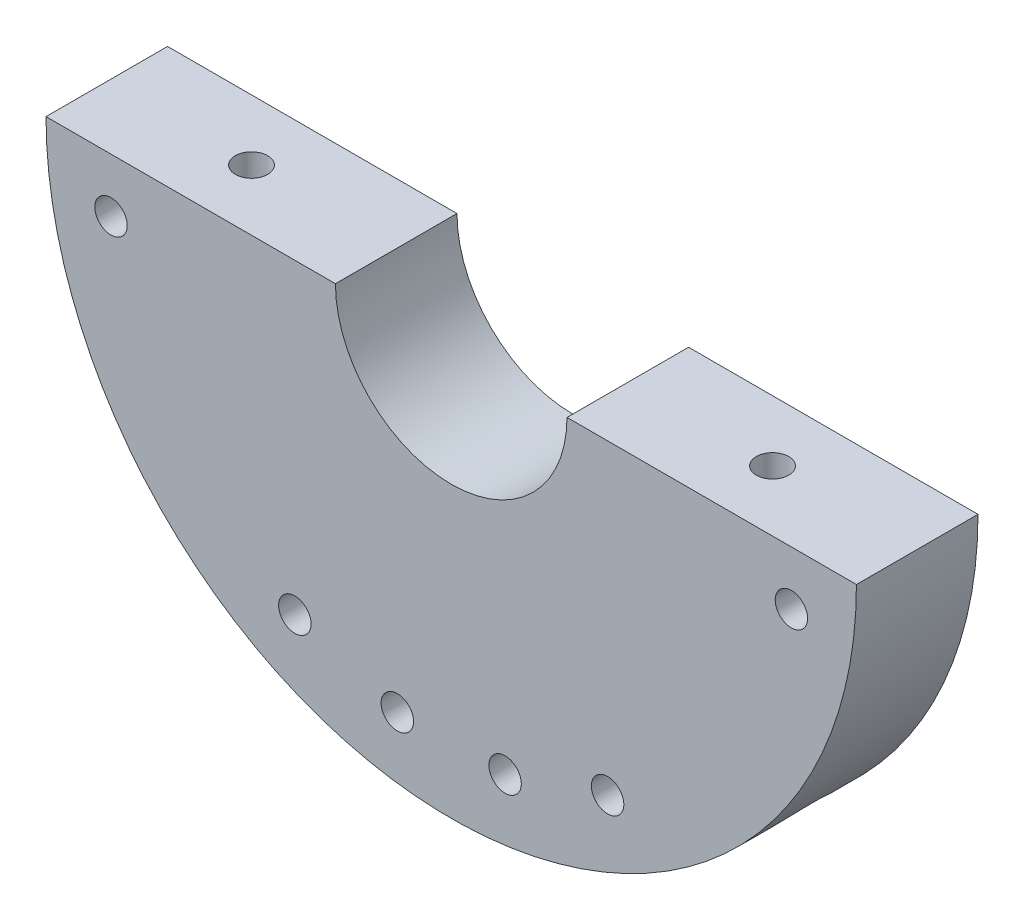
ISO-10303-21;
HEADER;
FILE_DESCRIPTION(('STEP AP214'),'2;1');
FILE_NAME('part.step','',(''),(''),'','','');
FILE_SCHEMA(('AUTOMOTIVE_DESIGN { 1 0 10303 214 1 1 1 1 }'));
ENDSEC;
DATA;
#1=APPLICATION_CONTEXT('core data for automotive mechanical design processes');
#2=APPLICATION_PROTOCOL_DEFINITION('international standard','automotive_design',2000,#1);
#3=PRODUCT_CONTEXT('',#1,'mechanical');
#4=PRODUCT('Part','Part','',(#3));
#5=PRODUCT_RELATED_PRODUCT_CATEGORY('part','',(#4));
#6=PRODUCT_DEFINITION_FORMATION('','',#4);
#7=PRODUCT_DEFINITION_CONTEXT('part definition',#1,'design');
#8=PRODUCT_DEFINITION('design','',#6,#7);
#9=PRODUCT_DEFINITION_SHAPE('','',#8);
#10=(LENGTH_UNIT() NAMED_UNIT(*) SI_UNIT(.MILLI.,.METRE.));
#11=(NAMED_UNIT(*) PLANE_ANGLE_UNIT() SI_UNIT($,.RADIAN.));
#12=(NAMED_UNIT(*) SI_UNIT($,.STERADIAN.) SOLID_ANGLE_UNIT());
#13=UNCERTAINTY_MEASURE_WITH_UNIT(LENGTH_MEASURE(1.E-05),#10,'distance_accuracy_value','');
#14=(GEOMETRIC_REPRESENTATION_CONTEXT(3) GLOBAL_UNCERTAINTY_ASSIGNED_CONTEXT((#13)) GLOBAL_UNIT_ASSIGNED_CONTEXT((#10,
#11,#12)) REPRESENTATION_CONTEXT('',''));
#15=CARTESIAN_POINT('',(0.,0.,0.));
#16=DIRECTION('',(0.,0.,1.));
#17=DIRECTION('',(1.,0.,0.));
#18=AXIS2_PLACEMENT_3D('',#15,#16,#17);
#19=CARTESIAN_POINT('',(0.,0.,30.));
#20=DIRECTION('',(0.,0.,-1.));
#21=DIRECTION('',(-1.,0.,0.));
#22=AXIS2_PLACEMENT_3D('',#19,#20,#21);
#23=CYLINDRICAL_SURFACE('',#22,28.575);
#24=CARTESIAN_POINT('',(0.,0.,0.));
#25=DIRECTION('',(0.,0.,-1.));
#26=DIRECTION('',(1.,0.,0.));
#27=AXIS2_PLACEMENT_3D('',#24,#25,#26);
#28=CIRCLE('',#27,28.575);
#29=CARTESIAN_POINT('',(28.575,0.,0.));
#30=VERTEX_POINT('',#29);
#31=CARTESIAN_POINT('',(-28.575,0.,0.));
#32=VERTEX_POINT('',#31);
#33=EDGE_CURVE('E102',#30,#32,#28,.T.);
#34=ORIENTED_EDGE('',*,*,#33,.T.);
#35=DIRECTION('',(0.,0.,-1.));
#36=VECTOR('',#35,1.);
#37=CARTESIAN_POINT('',(-28.575,0.,30.));
#38=LINE('',#37,#36);
#39=CARTESIAN_POINT('',(-28.575,0.,30.));
#40=VERTEX_POINT('',#39);
#41=EDGE_CURVE('E11',#40,#32,#38,.T.);
#42=ORIENTED_EDGE('',*,*,#41,.F.);
#43=CARTESIAN_POINT('',(0.,0.,30.));
#44=DIRECTION('',(0.,0.,-1.));
#45=DIRECTION('',(1.,0.,0.));
#46=AXIS2_PLACEMENT_3D('',#43,#44,#45);
#47=CIRCLE('',#46,28.575);
#48=CARTESIAN_POINT('',(28.575,0.,30.));
#49=VERTEX_POINT('',#48);
#50=EDGE_CURVE('E89',#49,#40,#47,.T.);
#51=ORIENTED_EDGE('',*,*,#50,.F.);
#52=DIRECTION('',(0.,0.,-1.));
#53=VECTOR('',#52,1.);
#54=CARTESIAN_POINT('',(28.575,0.,30.));
#55=LINE('',#54,#53);
#56=EDGE_CURVE('E98',#49,#30,#55,.T.);
#57=ORIENTED_EDGE('',*,*,#56,.T.);
#58=EDGE_LOOP('',(#34,#42,#51,#57));
#59=FACE_BOUND('',#58,.T.);
#60=ADVANCED_FACE('F32',(#59),#23,.F.);
#61=CARTESIAN_POINT('',(-100.,0.,30.));
#62=DIRECTION('',(0.,-1.,0.));
#63=DIRECTION('',(0.,0.,-1.));
#64=AXIS2_PLACEMENT_3D('',#61,#62,#63);
#65=PLANE('',#64);
#66=CARTESIAN_POINT('',(-64.2875,0.,15.));
#67=DIRECTION('',(0.,1.,0.));
#68=DIRECTION('',(0.,0.,1.));
#69=AXIS2_PLACEMENT_3D('',#66,#67,#68);
#70=CIRCLE('',#69,4.00000000000001);
#71=CARTESIAN_POINT('',(-64.2875,0.,19.));
#72=VERTEX_POINT('',#71);
#73=EDGE_CURVE('E105',#72,#72,#70,.T.);
#74=ORIENTED_EDGE('',*,*,#73,.F.);
#75=EDGE_LOOP('',(#74));
#76=FACE_BOUND('',#75,.T.);
#77=DIRECTION('',(-1.,0.,0.));
#78=VECTOR('',#77,1.);
#79=CARTESIAN_POINT('',(-100.,0.,0.));
#80=LINE('',#79,#78);
#81=CARTESIAN_POINT('',(-100.,0.,0.));
#82=VERTEX_POINT('',#81);
#83=EDGE_CURVE('E93',#32,#82,#80,.T.);
#84=ORIENTED_EDGE('',*,*,#83,.T.);
#85=DIRECTION('',(0.,0.,-1.));
#86=VECTOR('',#85,1.);
#87=CARTESIAN_POINT('',(-100.,0.,30.));
#88=LINE('',#87,#86);
#89=CARTESIAN_POINT('',(-100.,0.,30.));
#90=VERTEX_POINT('',#89);
#91=EDGE_CURVE('E45',#90,#82,#88,.T.);
#92=ORIENTED_EDGE('',*,*,#91,.F.);
#93=DIRECTION('',(-1.,0.,0.));
#94=VECTOR('',#93,1.);
#95=CARTESIAN_POINT('',(-100.,0.,30.));
#96=LINE('',#95,#94);
#97=EDGE_CURVE('E84',#40,#90,#96,.T.);
#98=ORIENTED_EDGE('',*,*,#97,.F.);
#99=ORIENTED_EDGE('',*,*,#41,.T.);
#100=EDGE_LOOP('',(#84,#92,#98,#99));
#101=FACE_BOUND('',#100,.T.);
#102=ADVANCED_FACE('F92',(#76,#101),#65,.F.);
#103=CARTESIAN_POINT('',(0.,0.,30.));
#104=DIRECTION('',(0.,0.,-1.));
#105=DIRECTION('',(-1.,0.,0.));
#106=AXIS2_PLACEMENT_3D('',#103,#104,#105);
#107=CYLINDRICAL_SURFACE('',#106,100.);
#108=CARTESIAN_POINT('',(-64.2875,-76.5971105443933,25.));
#109=CARTESIAN_POINT('',(-63.9629517728713,-76.8695019134588,24.9999998950727));
#110=CARTESIAN_POINT('',(-63.6366605399097,-77.1398338687823,24.9842079024863));
#111=CARTESIAN_POINT('',(-62.9824691419189,-77.6748811896209,24.9199266253946));
#112=CARTESIAN_POINT('',(-62.6545684866213,-77.9395946935992,24.8714266731006));
#113=CARTESIAN_POINT('',(-61.9993507515758,-78.4618132880969,24.7404351897563));
#114=CARTESIAN_POINT('',(-61.6720343056246,-78.7193127411085,24.6579178254226));
#115=CARTESIAN_POINT('',(-61.0210649378347,-79.2249919935222,24.4576058012039));
#116=CARTESIAN_POINT('',(-60.6974109623269,-79.4731745235494,24.3398215696995));
#117=CARTESIAN_POINT('',(-60.1200607640356,-79.9104655120402,24.0945332296665));
#118=CARTESIAN_POINT('',(-59.865130516254,-80.1015886110365,23.9735023051019));
#119=CARTESIAN_POINT('',(-59.3617301504954,-80.4753577280151,23.7073430088573));
#120=CARTESIAN_POINT('',(-59.113258875236,-80.6580052692694,23.5622189889461));
#121=CARTESIAN_POINT('',(-58.6252886222249,-81.0133726344612,23.2476381579096));
#122=CARTESIAN_POINT('',(-58.385779437742,-81.1861038795959,23.0782101597295));
#123=CARTESIAN_POINT('',(-57.9179724809073,-81.5204949099328,22.7147145389277));
#124=CARTESIAN_POINT('',(-57.6896729882618,-81.6821563954661,22.5206507135329));
#125=CARTESIAN_POINT('',(-57.2832743065724,-81.9675405816638,22.1417706970943));
#126=CARTESIAN_POINT('',(-57.103068567596,-82.093145772091,21.9606263784874));
#127=CARTESIAN_POINT('',(-56.754253877509,-82.3346807222192,21.5815288192315));
#128=CARTESIAN_POINT('',(-56.5856427000848,-82.4506123402951,21.3835788219052));
#129=CARTESIAN_POINT('',(-56.261848193746,-82.6718991443045,20.9713982044766));
#130=CARTESIAN_POINT('',(-56.1066655144979,-82.7772538185682,20.7571667976255));
#131=CARTESIAN_POINT('',(-55.8116539480961,-82.9764483080265,20.3132890861533));
#132=CARTESIAN_POINT('',(-55.6718253107279,-83.0702879358928,20.0836425308504));
#133=CARTESIAN_POINT('',(-55.4085556693316,-83.2461242509405,19.6085351698538));
#134=CARTESIAN_POINT('',(-55.2852319780441,-83.328036489372,19.3629778550541));
#135=CARTESIAN_POINT('',(-55.0579770496234,-83.4783669293242,18.8590533988895));
#136=CARTESIAN_POINT('',(-54.9540462178584,-83.5467848487754,18.6006859898987));
#137=CARTESIAN_POINT('',(-54.7673523681255,-83.6692870232798,18.0732718872626));
#138=CARTESIAN_POINT('',(-54.6845780925871,-83.7233789018894,17.8042309614953));
#139=CARTESIAN_POINT('',(-54.5416007240802,-83.8165920337851,17.2576974085827));
#140=CARTESIAN_POINT('',(-54.481394480968,-83.8557153764598,16.980205966848));
#141=CARTESIAN_POINT('',(-54.3904912986089,-83.9147007889124,16.4532263704925));
#142=CARTESIAN_POINT('',(-54.3571128725552,-83.9363156468991,16.2043926124368));
#143=CARTESIAN_POINT('',(-54.3091609902186,-83.9673499616295,15.7041732355423));
#144=CARTESIAN_POINT('',(-54.294585848622,-83.9767705113333,15.4527878474384));
#145=CARTESIAN_POINT('',(-54.2844617952553,-83.9833152612984,14.9495669406198));
#146=CARTESIAN_POINT('',(-54.288906099931,-83.9804438456627,14.6977316144103));
#147=CARTESIAN_POINT('',(-54.3167378718886,-83.9624455467664,14.1955526045503));
#148=CARTESIAN_POINT('',(-54.3401249873757,-83.9473188911031,13.9452088932854));
#149=CARTESIAN_POINT('',(-54.4035653107796,-83.9062179423422,13.46261621164));
#150=CARTESIAN_POINT('',(-54.4425591920584,-83.8809328149326,13.2301679442657));
#151=CARTESIAN_POINT('',(-54.536501861728,-83.8198848689336,12.7699349549747));
#152=CARTESIAN_POINT('',(-54.5914497924094,-83.7841226136065,12.5421499830581));
#153=CARTESIAN_POINT('',(-54.7166076930153,-83.7024397412082,12.0926914783492));
#154=CARTESIAN_POINT('',(-54.7868173992966,-83.6565192996167,11.8710178400597));
#155=CARTESIAN_POINT('',(-54.9416555557975,-83.5549104022568,11.4350731117044));
#156=CARTESIAN_POINT('',(-55.0262845399231,-83.4992215847902,11.2208022960981));
#157=CARTESIAN_POINT('',(-55.2120609187414,-83.3765022443579,10.7937635210634));
#158=CARTESIAN_POINT('',(-55.3136667901778,-83.3091542114949,10.5812864968271));
#159=CARTESIAN_POINT('',(-55.5300946393286,-83.1650496525276,10.1665149127583));
#160=CARTESIAN_POINT('',(-55.644916785231,-83.08829300669,9.96422048255483));
#161=CARTESIAN_POINT('',(-55.8865752091646,-82.9259422073476,9.57065482292584));
#162=CARTESIAN_POINT('',(-56.0134121179811,-82.8403475898205,9.37938417310721));
#163=CARTESIAN_POINT('',(-56.2779108505139,-82.6608874085786,9.00847294326511));
#164=CARTESIAN_POINT('',(-56.4155767052257,-82.5670187633353,8.82883673988206));
#165=CARTESIAN_POINT('',(-56.7159303221589,-82.3610336073531,8.46293314334318));
#166=CARTESIAN_POINT('',(-56.8797131334051,-82.2480418955664,8.27805557388535));
#167=CARTESIAN_POINT('',(-57.2174635048655,-82.0134395395503,7.92366080987084));
#168=CARTESIAN_POINT('',(-57.3914348479137,-81.8918256904888,7.75414938079013));
#169=CARTESIAN_POINT('',(-57.9263294591353,-81.5152123100459,7.26908966043244));
#170=CARTESIAN_POINT('',(-58.3003553743622,-81.248357663653,6.97686958944483));
#171=CARTESIAN_POINT('',(-59.1357420851636,-80.6428688156005,6.41196230962961));
#172=CARTESIAN_POINT('',(-59.6013094812153,-80.2996655201661,6.15052024197426));
#173=CARTESIAN_POINT('',(-60.5505101465405,-79.5863571337917,5.70974347246658));
#174=CARTESIAN_POINT('',(-61.0341539771382,-79.2162361926539,5.53045760858505));
#175=CARTESIAN_POINT('',(-61.8128265356257,-78.6086018811884,5.30627439739788));
#176=CARTESIAN_POINT('',(-62.1058441613575,-78.3773259461806,5.23631078309917));
#177=CARTESIAN_POINT('',(-62.6924209543452,-77.9089275253372,5.12351931882922));
#178=CARTESIAN_POINT('',(-62.9859800544241,-77.6718057248329,5.08068830357667));
#179=CARTESIAN_POINT('',(-63.5721532596953,-77.1927767084335,5.02126533797157));
#180=CARTESIAN_POINT('',(-63.8647665310273,-76.9508661657963,5.00469232661182));
#181=CARTESIAN_POINT('',(-64.4474035049074,-76.4635628188044,4.99703473770572));
#182=CARTESIAN_POINT('',(-64.7374271072784,-76.2181698806815,5.00595114192732));
#183=CARTESIAN_POINT('',(-65.367612821924,-75.6787807296257,5.05258673327036));
#184=CARTESIAN_POINT('',(-65.7069865607622,-75.3842934632284,5.09539002052659));
#185=CARTESIAN_POINT('',(-66.3783746784963,-74.7937919764094,5.21508576028551));
#186=CARTESIAN_POINT('',(-66.7103878630813,-74.4977775176555,5.29198370303256));
#187=CARTESIAN_POINT('',(-67.3654273715905,-73.905981765029,5.47936497113526));
#188=CARTESIAN_POINT('',(-67.6884477120844,-73.610200747891,5.58987010052805));
#189=CARTESIAN_POINT('',(-68.3234464719175,-73.0211896175313,5.84423092048077));
#190=CARTESIAN_POINT('',(-68.6354264841038,-72.7279591409716,5.9880817772767));
#191=CARTESIAN_POINT('',(-69.2135094285256,-72.1777789099009,6.29200012201713));
#192=CARTESIAN_POINT('',(-69.4809326010403,-71.9203254753562,6.44864814463729));
#193=CARTESIAN_POINT('',(-70.0039825872914,-71.4113124658167,6.78908021379796));
#194=CARTESIAN_POINT('',(-70.2596084549844,-71.159753364291,6.97286643164531));
#195=CARTESIAN_POINT('',(-70.7568610481115,-70.6653337291707,7.36795617206928));
#196=CARTESIAN_POINT('',(-70.9985056592362,-70.4224622409021,7.57922336205108));
#197=CARTESIAN_POINT('',(-71.4658338879364,-69.9481613151105,8.03028509039801));
#198=CARTESIAN_POINT('',(-71.6915239819197,-69.7167272464164,8.27006794615709));
#199=CARTESIAN_POINT('',(-72.0559046435133,-69.3396867299787,8.69887319146313));
#200=CARTESIAN_POINT('',(-72.1996042847782,-69.1900104502962,8.8800896250563));
#201=CARTESIAN_POINT('',(-72.4770314872022,-68.8993485231884,9.25663403711663));
#202=CARTESIAN_POINT('',(-72.6107596283696,-68.7583623703707,9.45196119350769));
#203=CARTESIAN_POINT('',(-72.8667355858708,-68.4870324022109,9.85665650007738));
#204=CARTESIAN_POINT('',(-72.9889956436174,-68.3566772588446,10.0660092599076));
#205=CARTESIAN_POINT('',(-73.22057102674,-68.1085659867326,10.4988405888884));
#206=CARTESIAN_POINT('',(-73.3298909505476,-67.9908053838098,10.7223140964993));
#207=CARTESIAN_POINT('',(-73.5118689850752,-67.793945481516,11.1334605131034));
#208=CARTESIAN_POINT('',(-73.5873576260511,-67.7119756868083,11.3185095532096));
#209=CARTESIAN_POINT('',(-73.728250188026,-67.5585373394029,11.6965338408945));
#210=CARTESIAN_POINT('',(-73.7936597524541,-67.4870629112517,11.8895045757753));
#211=CARTESIAN_POINT('',(-73.9134230112139,-67.3558742469153,12.2826820148191));
#212=CARTESIAN_POINT('',(-73.9677807313025,-67.2961557287625,12.4828860527624));
#213=CARTESIAN_POINT('',(-74.0645028724382,-67.1896911513701,12.8895752101037));
#214=CARTESIAN_POINT('',(-74.1068672291002,-67.1429451617722,13.0960603632146));
#215=CARTESIAN_POINT('',(-74.1790303579318,-67.063211840055,13.5156481608527));
#216=CARTESIAN_POINT('',(-74.2087239920269,-67.0303396524493,13.7287910017204));
#217=CARTESIAN_POINT('',(-74.2543578504359,-66.9797843302381,14.15834349671));
#218=CARTESIAN_POINT('',(-74.2702981379848,-66.9621011257969,14.3747531358071));
#219=CARTESIAN_POINT('',(-74.2880294333794,-66.9424294517646,14.8087793613365));
#220=CARTESIAN_POINT('',(-74.2898261485454,-66.9404346514713,15.0263954254649));
#221=CARTESIAN_POINT('',(-74.2792379369151,-66.9521835050522,15.4608430663889));
#222=CARTESIAN_POINT('',(-74.2668541349862,-66.9659259105749,15.6776747040405));
#223=CARTESIAN_POINT('',(-74.2305957080315,-67.0061137422655,16.0820669688064));
#224=CARTESIAN_POINT('',(-74.2083189559577,-67.0307919443402,16.2699522002876));
#225=CARTESIAN_POINT('',(-74.1534945846355,-67.0914369476683,16.6424368384239));
#226=CARTESIAN_POINT('',(-74.1209432156959,-67.1274078701409,16.8270350194561));
#227=CARTESIAN_POINT('',(-74.0461141754355,-67.2099402653216,17.1918313858531));
#228=CARTESIAN_POINT('',(-74.0038361025777,-67.2565021752454,17.3720293892304));
#229=CARTESIAN_POINT('',(-73.9101861440726,-67.3594033590699,17.7272076665236));
#230=CARTESIAN_POINT('',(-73.8588123405502,-67.4157446949568,17.9021868309143));
#231=CARTESIAN_POINT('',(-73.728566688712,-67.5582022189692,18.3053313384371));
#232=CARTESIAN_POINT('',(-73.6463079861344,-67.6479016499215,18.5311456649943));
#233=CARTESIAN_POINT('',(-73.4682532482857,-67.841233976529,18.9711652631048));
#234=CARTESIAN_POINT('',(-73.3724532909374,-67.9448709086061,19.1853671462832));
#235=CARTESIAN_POINT('',(-73.1687252493826,-68.1642139919544,19.6019207641407));
#236=CARTESIAN_POINT('',(-73.0607788745197,-68.2799383256957,19.8042539101129));
#237=CARTESIAN_POINT('',(-72.8342831386866,-68.5214903224244,20.1965186530575));
#238=CARTESIAN_POINT('',(-72.7157332797904,-68.6473184598453,20.3864496669161));
#239=CARTESIAN_POINT('',(-72.4193719912496,-68.9601174031217,20.8283141887979));
#240=CARTESIAN_POINT('',(-72.2369836916278,-69.1512354069067,21.0742579545904));
#241=CARTESIAN_POINT('',(-71.8564683529036,-69.5465550511894,21.5423044211171));
#242=CARTESIAN_POINT('',(-71.6583352281862,-69.750761744709,21.7643978245674));
#243=CARTESIAN_POINT('',(-71.2482278831173,-70.1696235461056,22.185738339949));
#244=CARTESIAN_POINT('',(-71.0362297963331,-70.3842964993492,22.3849443389662));
#245=CARTESIAN_POINT('',(-70.6005289743909,-70.8213286185023,22.7606972062608));
#246=CARTESIAN_POINT('',(-70.3768265517705,-71.0436875791207,22.9372446791482));
#247=CARTESIAN_POINT('',(-69.8477798638598,-71.5644106601263,23.3198902226587));
#248=CARTESIAN_POINT('',(-69.538723124665,-71.8648607392302,23.5180449396095));
#249=CARTESIAN_POINT('',(-68.9055782172428,-72.4721595503726,23.8772673899845));
#250=CARTESIAN_POINT('',(-68.5814843556527,-72.7790106813757,24.0383209361865));
#251=CARTESIAN_POINT('',(-67.9211761232697,-73.3956235159915,24.3233837705609));
#252=CARTESIAN_POINT('',(-67.5849826563888,-73.7053795749972,24.4474538061984));
#253=CARTESIAN_POINT('',(-66.9022085677099,-74.3256826947805,24.6587230738265));
#254=CARTESIAN_POINT('',(-66.5556328816891,-74.636229317429,24.7459395374562));
#255=CARTESIAN_POINT('',(-65.8910220460529,-75.2233249805003,24.8757757297461));
#256=CARTESIAN_POINT('',(-65.5738287296471,-75.5000075663545,24.9221269590012));
#257=CARTESIAN_POINT('',(-64.9341706316662,-76.0508489231398,24.9842417081516));
#258=CARTESIAN_POINT('',(-64.611704976275,-76.3250072636985,25.0000001048163));
#259=CARTESIAN_POINT('',(-64.2875,-76.5971105443933,25.));
#260=B_SPLINE_CURVE_WITH_KNOTS('',3,(#108,#109,#110,#111,#112,#113,#114,#115,#116,#117,#118,
#119,#120,#121,#122,#123,#124,#125,#126,#127,#128,#129,#130,#131,#132,#133,#134,#135,#136,#137,
#138,#139,#140,#141,#142,#143,#144,#145,#146,#147,#148,#149,#150,#151,#152,#153,#154,#155,#156,
#157,#158,#159,#160,#161,#162,#163,#164,#165,#166,#167,#168,#169,#170,#171,#172,#173,#174,#175,
#176,#177,#178,#179,#180,#181,#182,#183,#184,#185,#186,#187,#188,#189,#190,#191,#192,#193,#194,
#195,#196,#197,#198,#199,#200,#201,#202,#203,#204,#205,#206,#207,#208,#209,#210,#211,#212,#213,
#214,#215,#216,#217,#218,#219,#220,#221,#222,#223,#224,#225,#226,#227,#228,#229,#230,#231,#232,
#233,#234,#235,#236,#237,#238,#239,#240,#241,#242,#243,#244,#245,#246,#247,#248,#249,#250,#251,
#252,#253,#254,#255,#256,#257,#258,#259),.UNSPECIFIED.,.T.,.F.,(4,2,2,2,2,2,2,2,2,2,2,2,2,2,2,2,
2,2,2,2,2,2,2,2,2,2,2,2,2,2,2,2,2,2,2,2,2,2,2,2,2,2,2,2,2,2,2,2,2,2,2,2,2,2,2,2,2,2,2,2,2,2,2,2,
2,2,2,2,2,2,2,2,2,2,2,4),(0.,1.27081836579593,2.54205141298656,3.81425163537231,
5.08607604019589,6.10763940847684,7.12901845920287,8.14919649733743,9.16921748149424,
10.0225384732423,10.875695155573,11.7288930903111,12.5821049031458,13.4410910795334,
14.3000952092593,15.1586413000316,16.0170675065637,16.7720633475169,17.526991514477,
18.2816504480822,19.0362953669174,19.7466254362272,20.4569173243884,21.1671969434205,
21.8775028678666,22.6116095979196,23.3457256711219,24.0798803074403,24.8143095325681,
25.6283012902504,26.4425972096248,28.0705711334956,29.9680933503157,31.866742095563,
33.0052222180455,34.1435695012888,35.2827374620142,36.4219493003122,37.7746311674901,
39.1275309354702,40.4813103318395,41.8348936082554,43.0425707903207,44.2503446501484,
45.4565376405969,46.6622381563336,47.4881063620477,48.3139264922758,49.1388548369402,
49.9634891477206,50.6109511379816,51.2580492766754,51.9049112787235,52.5517767533222,
53.2039100148531,53.8560402779929,54.5079073751422,55.1597227666156,55.7314928004039,
56.303471741713,56.8754742996539,57.4475976108233,58.2160255435877,58.984676500963,
59.7545008237781,60.5243613155679,61.6055731741608,62.6872049894998,63.7707503403156,
64.8542667722735,66.2755350803036,67.697345972341,69.116808426757,70.535606446171,
71.8048682219256,73.0743425363527),.UNSPECIFIED.);
#261=CARTESIAN_POINT('',(-64.2875,-76.5971105443933,25.));
#262=VERTEX_POINT('',#261);
#263=EDGE_CURVE('E35',#262,#262,#260,.T.);
#264=ORIENTED_EDGE('',*,*,#263,.T.);
#265=EDGE_LOOP('',(#264));
#266=FACE_BOUND('',#265,.T.);
#267=CARTESIAN_POINT('',(64.2875,-76.5971105443933,25.));
#268=CARTESIAN_POINT('',(64.6105628490362,-76.3259625943039,24.9999985931011));
#269=CARTESIAN_POINT('',(64.9319853241337,-76.0527060021341,24.9843473231379));
#270=CARTESIAN_POINT('',(65.5697600638262,-75.5035358716926,24.9226276422304));
#271=CARTESIAN_POINT('',(65.8861098774688,-75.2276211463808,24.8765449559405));
#272=CARTESIAN_POINT('',(66.5131813254534,-74.6737720778507,24.7544203277255));
#273=CARTESIAN_POINT('',(66.8238796669975,-74.3958340494472,24.6782751568297));
#274=CARTESIAN_POINT('',(67.4369837327229,-73.8405331454978,24.4964727528223));
#275=CARTESIAN_POINT('',(67.7393900372415,-73.5631702309637,24.3908175908549));
#276=CARTESIAN_POINT('',(68.3811456003688,-72.9673855866571,24.1312619514989));
#277=CARTESIAN_POINT('',(68.7188549788406,-72.6493431638768,23.9723949244033));
#278=CARTESIAN_POINT('',(69.3788994973335,-72.0192788958793,23.6150195308966));
#279=CARTESIAN_POINT('',(69.701228820398,-71.7072593547562,23.4164963108874));
#280=CARTESIAN_POINT('',(70.3267083864251,-71.0939199220799,22.9795468120358));
#281=CARTESIAN_POINT('',(70.6299044458939,-70.7925752922116,22.7412212601328));
#282=CARTESIAN_POINT('',(71.2142197329827,-70.2047453790223,22.2230810509285));
#283=CARTESIAN_POINT('',(71.4953570156889,-69.9182480098514,21.9433008776483));
#284=CARTESIAN_POINT('',(71.9146310155544,-69.4862099417242,21.4713871423277));
#285=CARTESIAN_POINT('',(72.0618866573614,-69.3334462721592,21.2938969804992));
#286=CARTESIAN_POINT('',(72.3467200581165,-69.0361830058478,20.9248140162476));
#287=CARTESIAN_POINT('',(72.484295913776,-68.8916850353836,20.7332184554206));
#288=CARTESIAN_POINT('',(72.8802446962722,-68.4734708640764,20.1372672288347));
#289=CARTESIAN_POINT('',(73.1225607325447,-68.2142871925671,19.7109508136784));
#290=CARTESIAN_POINT('',(73.4213911766261,-67.8919389433855,19.075814098679));
#291=CARTESIAN_POINT('',(73.5020992199431,-67.8045277129808,18.8901200399768));
#292=CARTESIAN_POINT('',(73.6534014722771,-67.6401422305462,18.5102173904496));
#293=CARTESIAN_POINT('',(73.7240007007665,-67.5631627996924,18.3160130883413));
#294=CARTESIAN_POINT('',(73.8540310254292,-67.421001278601,17.9197535223643));
#295=CARTESIAN_POINT('',(73.913465166451,-67.3558159721485,17.7177004171472));
#296=CARTESIAN_POINT('',(74.0201477786428,-67.2385604371763,17.3066507690333));
#297=CARTESIAN_POINT('',(74.0673961940929,-67.1864902686263,17.097654194392));
#298=CARTESIAN_POINT('',(74.1491064641317,-67.0963021522562,16.6721438033304));
#299=CARTESIAN_POINT('',(74.1834488119635,-67.0583146478538,16.4555790955));
#300=CARTESIAN_POINT('',(74.2379349512325,-66.9979900969632,16.0184967974879));
#301=CARTESIAN_POINT('',(74.2580788163716,-66.9756529692363,15.7979792278309));
#302=CARTESIAN_POINT('',(74.2836495264712,-66.9472910729095,15.3551726707846));
#303=CARTESIAN_POINT('',(74.2890850861487,-66.9412566449125,15.1328848106446));
#304=CARTESIAN_POINT('',(74.2851183732472,-66.9456585725752,14.6886187122129));
#305=CARTESIAN_POINT('',(74.2757176123733,-66.956093250162,14.4666404446828));
#306=CARTESIAN_POINT('',(74.2446405778398,-66.9905499437746,14.0556550809005));
#307=CARTESIAN_POINT('',(74.224837360746,-67.0124981805563,13.8663253318118));
#308=CARTESIAN_POINT('',(74.1747603663776,-67.0679231882797,13.4906981341237));
#309=CARTESIAN_POINT('',(74.1444828220584,-67.1014041068799,13.304401801753));
#310=CARTESIAN_POINT('',(74.0739778556354,-67.1792270890532,12.9360167580337));
#311=CARTESIAN_POINT('',(74.0337500497258,-67.2235695715825,12.7539282092858));
#312=CARTESIAN_POINT('',(73.9439692351226,-67.3223132909695,12.3948364467735));
#313=CARTESIAN_POINT('',(73.8944141959986,-67.3767167179326,12.2178343499592));
#314=CARTESIAN_POINT('',(73.7695408161513,-67.5134497903447,11.8143244874028));
#315=CARTESIAN_POINT('',(73.6910377028291,-67.5991622480525,11.5899373759856));
#316=CARTESIAN_POINT('',(73.5206269510476,-67.7844622782387,11.1523267082913));
#317=CARTESIAN_POINT('',(73.4287157046417,-67.8840535850033,10.9391061778427));
#318=CARTESIAN_POINT('',(73.1348317851847,-68.2010182730658,10.3164782424934));
#319=CARTESIAN_POINT('',(72.9148349523914,-68.4364433549713,9.92449766778658));
#320=CARTESIAN_POINT('',(72.5091251386324,-68.8657133233687,9.2991639051974));
#321=CARTESIAN_POINT('',(72.3327993038294,-69.0509739620231,9.05340129791102));
#322=CARTESIAN_POINT('',(71.9644204556783,-69.4348100361612,8.58489146704253));
#323=CARTESIAN_POINT('',(71.7723614779028,-69.6333905159732,8.36215304497306));
#324=CARTESIAN_POINT('',(71.3745854995102,-70.0410580110282,7.93900169141368));
#325=CARTESIAN_POINT('',(71.1688506772708,-70.2501586457988,7.73861884017799));
#326=CARTESIAN_POINT('',(70.7457287061357,-70.6762482424572,7.35985030305714));
#327=CARTESIAN_POINT('',(70.528341603037,-70.8932371733404,7.18146453072573));
#328=CARTESIAN_POINT('',(70.0114129902491,-71.4042944682281,6.79190847858837));
#329=CARTESIAN_POINT('',(69.7080231220542,-71.7006128760342,6.58877055456096));
#330=CARTESIAN_POINT('',(69.0860490816207,-72.3001007375497,6.21906369151106));
#331=CARTESIAN_POINT('',(68.7674603567684,-72.603272229518,6.0525057943277));
#332=CARTESIAN_POINT('',(68.1172362850448,-73.213667202529,5.75549206896655));
#333=CARTESIAN_POINT('',(67.7855935813693,-73.5208929016414,5.62505694101296));
#334=CARTESIAN_POINT('',(67.111540074072,-74.1366952255688,5.40047004794917));
#335=CARTESIAN_POINT('',(66.7691303586883,-74.4452717111614,5.30631462866219));
#336=CARTESIAN_POINT('',(66.0720508299297,-75.0646630812445,5.15398960838477));
#337=CARTESIAN_POINT('',(65.717292669224,-75.375469501286,5.09618919242366));
#338=CARTESIAN_POINT('',(65.0009548555569,-75.9940775154362,5.0189801558658));
#339=CARTESIAN_POINT('',(64.6393745991541,-76.3018788400435,4.99957494770259));
#340=CARTESIAN_POINT('',(63.9121798485842,-76.9120169045503,5.00043879220649));
#341=CARTESIAN_POINT('',(63.5465691663113,-77.2143581956844,5.0206731014273));
#342=CARTESIAN_POINT('',(62.8138770895649,-77.8115674493424,5.10231123368296));
#343=CARTESIAN_POINT('',(62.4467960879,-78.1064372713941,5.16370470631362));
#344=CARTESIAN_POINT('',(61.7897278454151,-78.6267603184842,5.3123724965497));
#345=CARTESIAN_POINT('',(61.4993835334874,-78.8540376129901,5.39174688960931));
#346=CARTESIAN_POINT('',(60.9218768124167,-79.3010603615326,5.57850039859255));
#347=CARTESIAN_POINT('',(60.6347142057777,-79.5208062848518,5.68587776603798));
#348=CARTESIAN_POINT('',(60.066207424035,-79.9510956847711,5.92937611353243));
#349=CARTESIAN_POINT('',(59.7848575361755,-80.1616484476512,6.065467238371));
#350=CARTESIAN_POINT('',(59.2303991926325,-80.5721957352097,6.367196349873));
#351=CARTESIAN_POINT('',(58.9572893256344,-80.7721920723948,6.5328292427768));
#352=CARTESIAN_POINT('',(58.4713010130476,-81.1244717917509,6.86111703778719));
#353=CARTESIAN_POINT('',(58.2565318668119,-81.2787982833601,7.01879114176533));
#354=CARTESIAN_POINT('',(57.8365159168916,-81.5782072653946,7.35428117299089));
#355=CARTESIAN_POINT('',(57.6312672678293,-81.7232915493088,7.5320931736775));
#356=CARTESIAN_POINT('',(57.2323386649002,-82.0031633448019,7.90776696667917));
#357=CARTESIAN_POINT('',(57.0386597039203,-82.1379499729332,8.10563047585589));
#358=CARTESIAN_POINT('',(56.6651427290731,-82.3960748130687,8.52098240931992));
#359=CARTESIAN_POINT('',(56.485304975561,-82.5194128097313,8.73847120259485));
#360=CARTESIAN_POINT('',(56.1404100887515,-82.7544457086982,9.19420450495614));
#361=CARTESIAN_POINT('',(55.9754899813083,-82.8660339681496,9.43260818824895));
#362=CARTESIAN_POINT('',(55.6646464815772,-83.0751602259131,9.92735435981925));
#363=CARTESIAN_POINT('',(55.5187236893547,-83.1726977804179,10.1836974143519));
#364=CARTESIAN_POINT('',(55.2484526924319,-83.3524733991459,10.7123793632499));
#365=CARTESIAN_POINT('',(55.1240882082256,-83.4347230113025,10.9847059779552));
#366=CARTESIAN_POINT('',(54.8991297671824,-83.5829152978109,11.5432538902427));
#367=CARTESIAN_POINT('',(54.7985310995553,-83.6488612039561,11.8294724206287));
#368=CARTESIAN_POINT('',(54.6358090447182,-83.7552170938701,12.3707800383199));
#369=CARTESIAN_POINT('',(54.5702246039975,-83.7979413610962,12.6243805519839));
#370=CARTESIAN_POINT('',(54.458924619118,-83.8703162779934,13.1377287682078));
#371=CARTESIAN_POINT('',(54.4132068075556,-83.8999684196085,13.3974757656917));
#372=CARTESIAN_POINT('',(54.3424007129707,-83.9458472352259,13.9207931221423));
#373=CARTESIAN_POINT('',(54.3173011130086,-83.9620812741969,14.1843613027759));
#374=CARTESIAN_POINT('',(54.2881095776865,-83.9809589767317,14.7131402530053));
#375=CARTESIAN_POINT('',(54.2840164169233,-83.9836034330389,14.9783509258833));
#376=CARTESIAN_POINT('',(54.2962764102548,-83.9756773911047,15.4824466140902));
#377=CARTESIAN_POINT('',(54.3106939851077,-83.9663579149994,15.7214015547883));
#378=CARTESIAN_POINT('',(54.3565232745498,-83.9366971288791,16.1969796284093));
#379=CARTESIAN_POINT('',(54.3879342927446,-83.9163562705223,16.4336028564818));
#380=CARTESIAN_POINT('',(54.4673207524808,-83.8648508089396,16.902811224293));
#381=CARTESIAN_POINT('',(54.5152935862965,-83.8336879096838,17.1353969936945));
#382=CARTESIAN_POINT('',(54.6271771609166,-83.7608259599458,17.5950159734512));
#383=CARTESIAN_POINT('',(54.6910883292108,-83.7191266268603,17.8220490346952));
#384=CARTESIAN_POINT('',(54.8341260972892,-83.6255099911682,18.2693932972672));
#385=CARTESIAN_POINT('',(54.9132700447083,-83.5735810371026,18.4896964997315));
#386=CARTESIAN_POINT('',(55.0857777816185,-83.459976900527,18.9220509893126));
#387=CARTESIAN_POINT('',(55.1791414218876,-83.3983018202931,19.1341023629951));
#388=CARTESIAN_POINT('',(55.3790400429855,-83.2656970261146,19.5488838674843));
#389=CARTESIAN_POINT('',(55.4855750267693,-83.1947673100938,19.7516139961998));
#390=CARTESIAN_POINT('',(55.7107404477574,-83.0441554032466,20.1469376239419));
#391=CARTESIAN_POINT('',(55.8293754097858,-82.9644699373132,20.3395272897892));
#392=CARTESIAN_POINT('',(56.0878779771238,-82.7899524685379,20.7293400870676));
#393=CARTESIAN_POINT('',(56.2286907134735,-82.6944121339897,20.9256192978461));
#394=CARTESIAN_POINT('',(56.5217129347411,-82.4944085445617,21.3047588777629));
#395=CARTESIAN_POINT('',(56.6739265905987,-82.389942022117,21.4876142869838));
#396=CARTESIAN_POINT('',(56.9882655227444,-82.1728304511848,21.8393568975393));
#397=CARTESIAN_POINT('',(57.1503897663688,-82.0601862545662,22.0082455498824));
#398=CARTESIAN_POINT('',(57.4832499126755,-81.8273625523944,22.3318546037871));
#399=CARTESIAN_POINT('',(57.653988951432,-81.7071802988087,22.4865697871755));
#400=CARTESIAN_POINT('',(58.0283151857472,-81.4418481129029,22.8032800863321));
#401=CARTESIAN_POINT('',(58.2330496801062,-81.2956201027505,22.9630200417989));
#402=CARTESIAN_POINT('',(58.6503224956738,-80.9950983901741,23.2636813748531));
#403=CARTESIAN_POINT('',(58.8628637479549,-80.8408016489136,23.4045955902458));
#404=CARTESIAN_POINT('',(59.5099037194538,-80.3670096446678,23.7994201045186));
#405=CARTESIAN_POINT('',(59.9537745721035,-80.0366437203069,24.0253756339881));
#406=CARTESIAN_POINT('',(60.9406869623343,-79.2886236910676,24.441301905828));
#407=CARTESIAN_POINT('',(61.4864879396099,-78.8663437145577,24.6161750592913));
#408=CARTESIAN_POINT('',(62.5819371505516,-77.9999238402479,24.8694807720256));
#409=CARTESIAN_POINT('',(63.1315806984265,-77.5558075631422,24.9480152550386));
#410=CARTESIAN_POINT('',(63.8814246130073,-76.9365589452523,24.9938399704077));
#411=CARTESIAN_POINT('',(64.0847852373881,-76.767249860935,25.0000008827978));
#412=CARTESIAN_POINT('',(64.2875,-76.5971105443933,25.));
#413=B_SPLINE_CURVE_WITH_KNOTS('',3,(#267,#268,#269,#270,#271,#272,#273,#274,#275,#276,#277,
#278,#279,#280,#281,#282,#283,#284,#285,#286,#287,#288,#289,#290,#291,#292,#293,#294,#295,#296,
#297,#298,#299,#300,#301,#302,#303,#304,#305,#306,#307,#308,#309,#310,#311,#312,#313,#314,#315,
#316,#317,#318,#319,#320,#321,#322,#323,#324,#325,#326,#327,#328,#329,#330,#331,#332,#333,#334,
#335,#336,#337,#338,#339,#340,#341,#342,#343,#344,#345,#346,#347,#348,#349,#350,#351,#352,#353,
#354,#355,#356,#357,#358,#359,#360,#361,#362,#363,#364,#365,#366,#367,#368,#369,#370,#371,#372,
#373,#374,#375,#376,#377,#378,#379,#380,#381,#382,#383,#384,#385,#386,#387,#388,#389,#390,#391,
#392,#393,#394,#395,#396,#397,#398,#399,#400,#401,#402,#403,#404,#405,#406,#407,#408,#409,#410,
#411,#412),.UNSPECIFIED.,.T.,.F.,(4,2,2,2,2,2,2,2,2,2,2,2,2,2,2,2,2,2,2,2,2,2,2,2,2,2,2,2,2,2,2,
2,2,2,2,2,2,2,2,2,2,2,2,2,2,2,2,2,2,2,2,2,2,2,2,2,2,2,2,2,2,2,2,2,2,2,2,2,2,2,2,2,4),(0.,
1.26520510333312,2.53100413506628,3.80118802571214,5.07128279151461,6.54047358610224,
8.01021571519887,9.47629324587697,10.941157996742,11.7704247999377,12.5998542047215,
14.2548175889204,14.9159594318367,15.5767718416893,16.2374037779116,16.8980387348644,
17.5646484969697,18.2312547987876,18.8974660477137,19.5636094193109,20.1378246601843,
20.712246630042,21.2866907602004,21.8612600851033,22.6182166696514,23.3753773179329,
24.890989478248,25.9539000895883,27.0172155313561,28.0819448741123,29.1466700324584,
30.5554426780577,31.9646399850793,33.374643172237,34.784504303441,36.208460743799,
37.6325437348062,39.0553790967324,40.4778567886144,41.6083285044318,42.7387296515987,
43.86796120252,44.9969982328187,45.9198353837968,46.8424929053974,47.7652294941598,
48.6879834355044,49.6184978025618,50.5490415545098,51.4788795267592,52.4085330343235,
53.2036632572369,53.998702707078,54.7933054829345,55.5878619053919,56.3057183125423,
57.0235453040313,57.7412593222247,58.4589925926447,59.1775481322802,59.8960961318792,
60.6146442926803,61.3334621488792,62.1119878328563,62.8907997389223,63.6695306321928,
64.4485470841974,65.3417126687813,66.2352170936318,68.0224198033769,70.1507065064138,
72.276739591543,73.0706276939437),.UNSPECIFIED.);
#414=CARTESIAN_POINT('',(64.2875,-76.5971105443933,25.));
#415=VERTEX_POINT('',#414);
#416=EDGE_CURVE('E114',#415,#415,#413,.T.);
#417=ORIENTED_EDGE('',*,*,#416,.T.);
#418=EDGE_LOOP('',(#417));
#419=FACE_BOUND('',#418,.T.);
#420=CARTESIAN_POINT('',(0.,0.,0.));
#421=DIRECTION('',(0.,0.,1.));
#422=DIRECTION('',(1.,0.,0.));
#423=AXIS2_PLACEMENT_3D('',#420,#421,#422);
#424=CIRCLE('',#423,100.);
#425=CARTESIAN_POINT('',(100.,0.,0.));
#426=VERTEX_POINT('',#425);
#427=EDGE_CURVE('E71',#82,#426,#424,.T.);
#428=ORIENTED_EDGE('',*,*,#427,.T.);
#429=DIRECTION('',(0.,0.,-1.));
#430=VECTOR('',#429,1.);
#431=CARTESIAN_POINT('',(100.,0.,30.));
#432=LINE('',#431,#430);
#433=CARTESIAN_POINT('',(100.,0.,30.));
#434=VERTEX_POINT('',#433);
#435=EDGE_CURVE('E94',#434,#426,#432,.T.);
#436=ORIENTED_EDGE('',*,*,#435,.F.);
#437=CARTESIAN_POINT('',(0.,0.,30.));
#438=DIRECTION('',(0.,0.,1.));
#439=DIRECTION('',(1.,0.,0.));
#440=AXIS2_PLACEMENT_3D('',#437,#438,#439);
#441=CIRCLE('',#440,100.);
#442=EDGE_CURVE('E87',#90,#434,#441,.T.);
#443=ORIENTED_EDGE('',*,*,#442,.F.);
#444=ORIENTED_EDGE('',*,*,#91,.T.);
#445=EDGE_LOOP('',(#428,#436,#443,#444));
#446=FACE_BOUND('',#445,.T.);
#447=ADVANCED_FACE('F96',(#266,#419,#446),#107,.T.);
#448=CARTESIAN_POINT('',(28.575,0.,30.));
#449=DIRECTION('',(0.,-1.,0.));
#450=DIRECTION('',(0.,0.,-1.));
#451=AXIS2_PLACEMENT_3D('',#448,#449,#450);
#452=PLANE('',#451);
#453=CARTESIAN_POINT('',(64.2875,0.,15.));
#454=DIRECTION('',(0.,1.,0.));
#455=DIRECTION('',(0.,0.,1.));
#456=AXIS2_PLACEMENT_3D('',#453,#454,#455);
#457=CIRCLE('',#456,4.00000000000001);
#458=CARTESIAN_POINT('',(64.2875,0.,19.));
#459=VERTEX_POINT('',#458);
#460=EDGE_CURVE('E120',#459,#459,#457,.T.);
#461=ORIENTED_EDGE('',*,*,#460,.F.);
#462=EDGE_LOOP('',(#461));
#463=FACE_BOUND('',#462,.T.);
#464=DIRECTION('',(-1.,0.,0.));
#465=VECTOR('',#464,1.);
#466=CARTESIAN_POINT('',(28.575,0.,0.));
#467=LINE('',#466,#465);
#468=EDGE_CURVE('E77',#426,#30,#467,.T.);
#469=ORIENTED_EDGE('',*,*,#468,.T.);
#470=ORIENTED_EDGE('',*,*,#56,.F.);
#471=DIRECTION('',(-1.,0.,0.));
#472=VECTOR('',#471,1.);
#473=CARTESIAN_POINT('',(28.575,0.,30.));
#474=LINE('',#473,#472);
#475=EDGE_CURVE('E54',#434,#49,#474,.T.);
#476=ORIENTED_EDGE('',*,*,#475,.F.);
#477=ORIENTED_EDGE('',*,*,#435,.T.);
#478=EDGE_LOOP('',(#469,#470,#476,#477));
#479=FACE_BOUND('',#478,.T.);
#480=ADVANCED_FACE('F142',(#463,#479),#452,.F.);
#481=CARTESIAN_POINT('',(0.,0.,30.));
#482=DIRECTION('',(0.,0.,1.));
#483=DIRECTION('',(1.,0.,0.));
#484=AXIS2_PLACEMENT_3D('',#481,#482,#483);
#485=PLANE('',#484);
#486=CARTESIAN_POINT('',(83.9535089505868,-13.2969295284194,30.));
#487=DIRECTION('',(0.,0.,-1.));
#488=DIRECTION('',(-1.,0.,0.));
#489=AXIS2_PLACEMENT_3D('',#486,#487,#488);
#490=CIRCLE('',#489,4.00000000000001);
#491=CARTESIAN_POINT('',(79.9535089505867,-13.2969295284194,30.));
#492=VERTEX_POINT('',#491);
#493=EDGE_CURVE('E199',#492,#492,#490,.T.);
#494=ORIENTED_EDGE('',*,*,#493,.T.);
#495=EDGE_LOOP('',(#494));
#496=FACE_BOUND('',#495,.T.);
#497=CARTESIAN_POINT('',(38.5891924778616,-75.7355545560113,30.));
#498=DIRECTION('',(0.,0.,-1.));
#499=DIRECTION('',(-1.,0.,0.));
#500=AXIS2_PLACEMENT_3D('',#497,#498,#499);
#501=CIRCLE('',#500,4.00000000000001);
#502=CARTESIAN_POINT('',(34.5891924778615,-75.7355545560113,30.));
#503=VERTEX_POINT('',#502);
#504=EDGE_CURVE('E193',#503,#503,#501,.T.);
#505=ORIENTED_EDGE('',*,*,#504,.T.);
#506=EDGE_LOOP('',(#505));
#507=FACE_BOUND('',#506,.T.);
#508=CARTESIAN_POINT('',(13.2969295284208,-83.9535089505865,30.));
#509=DIRECTION('',(0.,0.,-1.));
#510=DIRECTION('',(-1.,0.,0.));
#511=AXIS2_PLACEMENT_3D('',#508,#509,#510);
#512=CIRCLE('',#511,4.00000000000001);
#513=CARTESIAN_POINT('',(9.29692952842079,-83.9535089505865,30.));
#514=VERTEX_POINT('',#513);
#515=EDGE_CURVE('E187',#514,#514,#512,.T.);
#516=ORIENTED_EDGE('',*,*,#515,.T.);
#517=EDGE_LOOP('',(#516));
#518=FACE_BOUND('',#517,.T.);
#519=CARTESIAN_POINT('',(-13.2969295284184,-83.9535089505869,30.));
#520=DIRECTION('',(0.,0.,-1.));
#521=DIRECTION('',(-1.,0.,0.));
#522=AXIS2_PLACEMENT_3D('',#519,#520,#521);
#523=CIRCLE('',#522,4.00000000000001);
#524=CARTESIAN_POINT('',(-17.2969295284184,-83.9535089505869,30.));
#525=VERTEX_POINT('',#524);
#526=EDGE_CURVE('E181',#525,#525,#523,.T.);
#527=ORIENTED_EDGE('',*,*,#526,.T.);
#528=EDGE_LOOP('',(#527));
#529=FACE_BOUND('',#528,.T.);
#530=CARTESIAN_POINT('',(-38.5891924778605,-75.7355545560118,30.));
#531=DIRECTION('',(0.,0.,-1.));
#532=DIRECTION('',(-1.,0.,0.));
#533=AXIS2_PLACEMENT_3D('',#530,#531,#532);
#534=CIRCLE('',#533,3.99999999999999);
#535=CARTESIAN_POINT('',(-42.5891924778605,-75.7355545560118,30.));
#536=VERTEX_POINT('',#535);
#537=EDGE_CURVE('E175',#536,#536,#534,.T.);
#538=ORIENTED_EDGE('',*,*,#537,.T.);
#539=EDGE_LOOP('',(#538));
#540=FACE_BOUND('',#539,.T.);
#541=CARTESIAN_POINT('',(-83.9535089505866,-13.2969295284205,30.));
#542=DIRECTION('',(0.,0.,-1.));
#543=DIRECTION('',(-1.,0.,0.));
#544=AXIS2_PLACEMENT_3D('',#541,#542,#543);
#545=CIRCLE('',#544,4.00000000000002);
#546=CARTESIAN_POINT('',(-87.9535089505866,-13.2969295284205,30.));
#547=VERTEX_POINT('',#546);
#548=EDGE_CURVE('E171',#547,#547,#545,.T.);
#549=ORIENTED_EDGE('',*,*,#548,.T.);
#550=EDGE_LOOP('',(#549));
#551=FACE_BOUND('',#550,.T.);
#552=ORIENTED_EDGE('',*,*,#50,.T.);
#553=ORIENTED_EDGE('',*,*,#97,.T.);
#554=ORIENTED_EDGE('',*,*,#442,.T.);
#555=ORIENTED_EDGE('',*,*,#475,.T.);
#556=EDGE_LOOP('',(#552,#553,#554,#555));
#557=FACE_BOUND('',#556,.T.);
#558=ADVANCED_FACE('F85',(#496,#507,#518,#529,#540,#551,#557),#485,.T.);
#559=CARTESIAN_POINT('',(0.,0.,0.));
#560=DIRECTION('',(0.,0.,1.));
#561=DIRECTION('',(1.,0.,0.));
#562=AXIS2_PLACEMENT_3D('',#559,#560,#561);
#563=PLANE('',#562);
#564=CARTESIAN_POINT('',(83.9535089505868,-13.2969295284194,0.));
#565=DIRECTION('',(0.,0.,-1.));
#566=DIRECTION('',(-1.,0.,0.));
#567=AXIS2_PLACEMENT_3D('',#564,#565,#566);
#568=CIRCLE('',#567,4.00000000000001);
#569=CARTESIAN_POINT('',(79.9535089505867,-13.2969295284194,0.));
#570=VERTEX_POINT('',#569);
#571=EDGE_CURVE('E202',#570,#570,#568,.T.);
#572=ORIENTED_EDGE('',*,*,#571,.F.);
#573=EDGE_LOOP('',(#572));
#574=FACE_BOUND('',#573,.T.);
#575=CARTESIAN_POINT('',(38.5891924778616,-75.7355545560113,0.));
#576=DIRECTION('',(0.,0.,-1.));
#577=DIRECTION('',(-1.,0.,0.));
#578=AXIS2_PLACEMENT_3D('',#575,#576,#577);
#579=CIRCLE('',#578,4.00000000000001);
#580=CARTESIAN_POINT('',(34.5891924778615,-75.7355545560113,0.));
#581=VERTEX_POINT('',#580);
#582=EDGE_CURVE('E196',#581,#581,#579,.T.);
#583=ORIENTED_EDGE('',*,*,#582,.F.);
#584=EDGE_LOOP('',(#583));
#585=FACE_BOUND('',#584,.T.);
#586=CARTESIAN_POINT('',(13.2969295284208,-83.9535089505865,0.));
#587=DIRECTION('',(0.,0.,-1.));
#588=DIRECTION('',(-1.,0.,0.));
#589=AXIS2_PLACEMENT_3D('',#586,#587,#588);
#590=CIRCLE('',#589,4.00000000000001);
#591=CARTESIAN_POINT('',(9.29692952842079,-83.9535089505865,0.));
#592=VERTEX_POINT('',#591);
#593=EDGE_CURVE('E190',#592,#592,#590,.T.);
#594=ORIENTED_EDGE('',*,*,#593,.F.);
#595=EDGE_LOOP('',(#594));
#596=FACE_BOUND('',#595,.T.);
#597=CARTESIAN_POINT('',(-13.2969295284184,-83.9535089505869,0.));
#598=DIRECTION('',(0.,0.,-1.));
#599=DIRECTION('',(-1.,0.,0.));
#600=AXIS2_PLACEMENT_3D('',#597,#598,#599);
#601=CIRCLE('',#600,4.00000000000001);
#602=CARTESIAN_POINT('',(-17.2969295284184,-83.9535089505869,0.));
#603=VERTEX_POINT('',#602);
#604=EDGE_CURVE('E184',#603,#603,#601,.T.);
#605=ORIENTED_EDGE('',*,*,#604,.F.);
#606=EDGE_LOOP('',(#605));
#607=FACE_BOUND('',#606,.T.);
#608=CARTESIAN_POINT('',(-38.5891924778605,-75.7355545560118,0.));
#609=DIRECTION('',(0.,0.,-1.));
#610=DIRECTION('',(-1.,0.,0.));
#611=AXIS2_PLACEMENT_3D('',#608,#609,#610);
#612=CIRCLE('',#611,3.99999999999999);
#613=CARTESIAN_POINT('',(-42.5891924778605,-75.7355545560118,0.));
#614=VERTEX_POINT('',#613);
#615=EDGE_CURVE('E178',#614,#614,#612,.T.);
#616=ORIENTED_EDGE('',*,*,#615,.F.);
#617=EDGE_LOOP('',(#616));
#618=FACE_BOUND('',#617,.T.);
#619=CARTESIAN_POINT('',(-83.9535089505866,-13.2969295284205,0.));
#620=DIRECTION('',(0.,0.,-1.));
#621=DIRECTION('',(-1.,0.,0.));
#622=AXIS2_PLACEMENT_3D('',#619,#620,#621);
#623=CIRCLE('',#622,4.00000000000002);
#624=CARTESIAN_POINT('',(-87.9535089505866,-13.2969295284205,0.));
#625=VERTEX_POINT('',#624);
#626=EDGE_CURVE('E172',#625,#625,#623,.T.);
#627=ORIENTED_EDGE('',*,*,#626,.F.);
#628=EDGE_LOOP('',(#627));
#629=FACE_BOUND('',#628,.T.);
#630=ORIENTED_EDGE('',*,*,#33,.F.);
#631=ORIENTED_EDGE('',*,*,#468,.F.);
#632=ORIENTED_EDGE('',*,*,#427,.F.);
#633=ORIENTED_EDGE('',*,*,#83,.F.);
#634=EDGE_LOOP('',(#630,#631,#632,#633));
#635=FACE_BOUND('',#634,.T.);
#636=ADVANCED_FACE('F138',(#574,#585,#596,#607,#618,#629,#635),#563,.F.);
#637=CARTESIAN_POINT('',(-64.2875,-100.,15.));
#638=DIRECTION('',(0.,1.,0.));
#639=DIRECTION('',(0.,0.,1.));
#640=AXIS2_PLACEMENT_3D('',#637,#638,#639);
#641=CYLINDRICAL_SURFACE('',#640,4.00000000000001);
#642=CARTESIAN_POINT('',(-64.2875,-15.,15.));
#643=DIRECTION('',(0.,1.,0.));
#644=DIRECTION('',(0.,0.,1.));
#645=AXIS2_PLACEMENT_3D('',#642,#643,#644);
#646=CIRCLE('',#645,4.00000000000001);
#647=CARTESIAN_POINT('',(-64.2875,-15.,19.));
#648=VERTEX_POINT('',#647);
#649=EDGE_CURVE('E121',#648,#648,#646,.F.);
#650=ORIENTED_EDGE('',*,*,#649,.T.);
#651=EDGE_LOOP('',(#650));
#652=FACE_BOUND('',#651,.T.);
#653=ORIENTED_EDGE('',*,*,#73,.T.);
#654=EDGE_LOOP('',(#653));
#655=FACE_BOUND('',#654,.T.);
#656=ADVANCED_FACE('F134',(#652,#655),#641,.F.);
#657=CARTESIAN_POINT('',(64.2875,-100.,15.));
#658=DIRECTION('',(0.,1.,0.));
#659=DIRECTION('',(0.,0.,1.));
#660=AXIS2_PLACEMENT_3D('',#657,#658,#659);
#661=CYLINDRICAL_SURFACE('',#660,4.00000000000001);
#662=CARTESIAN_POINT('',(64.2875,-15.,15.));
#663=DIRECTION('',(0.,1.,0.));
#664=DIRECTION('',(0.,0.,1.));
#665=AXIS2_PLACEMENT_3D('',#662,#663,#664);
#666=CIRCLE('',#665,4.00000000000001);
#667=CARTESIAN_POINT('',(64.2875,-15.,19.));
#668=VERTEX_POINT('',#667);
#669=EDGE_CURVE('E111',#668,#668,#666,.F.);
#670=ORIENTED_EDGE('',*,*,#669,.T.);
#671=EDGE_LOOP('',(#670));
#672=FACE_BOUND('',#671,.T.);
#673=ORIENTED_EDGE('',*,*,#460,.T.);
#674=EDGE_LOOP('',(#673));
#675=FACE_BOUND('',#674,.T.);
#676=ADVANCED_FACE('F130',(#672,#675),#661,.F.);
#677=CARTESIAN_POINT('',(64.2875,-100.,15.));
#678=DIRECTION('',(0.,1.,0.));
#679=DIRECTION('',(0.,0.,1.));
#680=AXIS2_PLACEMENT_3D('',#677,#678,#679);
#681=CYLINDRICAL_SURFACE('',#680,9.99999999999999);
#682=CARTESIAN_POINT('',(64.2875,-15.,15.));
#683=DIRECTION('',(0.,1.,0.));
#684=DIRECTION('',(0.,0.,1.));
#685=AXIS2_PLACEMENT_3D('',#682,#683,#684);
#686=CIRCLE('',#685,9.99999999999999);
#687=CARTESIAN_POINT('',(64.2875,-15.,25.));
#688=VERTEX_POINT('',#687);
#689=EDGE_CURVE('E115',#688,#688,#686,.T.);
#690=ORIENTED_EDGE('',*,*,#689,.T.);
#691=EDGE_LOOP('',(#690));
#692=FACE_BOUND('',#691,.T.);
#693=ORIENTED_EDGE('',*,*,#416,.F.);
#694=EDGE_LOOP('',(#693));
#695=FACE_BOUND('',#694,.T.);
#696=ADVANCED_FACE('F124',(#692,#695),#681,.F.);
#697=CARTESIAN_POINT('',(64.2875,-15.,15.));
#698=DIRECTION('',(0.,1.,0.));
#699=DIRECTION('',(0.,0.,1.));
#700=AXIS2_PLACEMENT_3D('',#697,#698,#699);
#701=PLANE('',#700);
#702=ORIENTED_EDGE('',*,*,#689,.F.);
#703=EDGE_LOOP('',(#702));
#704=FACE_BOUND('',#703,.T.);
#705=ORIENTED_EDGE('',*,*,#669,.F.);
#706=EDGE_LOOP('',(#705));
#707=FACE_BOUND('',#706,.T.);
#708=ADVANCED_FACE('F129',(#704,#707),#701,.F.);
#709=CARTESIAN_POINT('',(-64.2875,-100.,15.));
#710=DIRECTION('',(0.,1.,0.));
#711=DIRECTION('',(0.,0.,1.));
#712=AXIS2_PLACEMENT_3D('',#709,#710,#711);
#713=CYLINDRICAL_SURFACE('',#712,10.);
#714=CARTESIAN_POINT('',(-64.2875,-15.,15.));
#715=DIRECTION('',(0.,1.,0.));
#716=DIRECTION('',(0.,0.,1.));
#717=AXIS2_PLACEMENT_3D('',#714,#715,#716);
#718=CIRCLE('',#717,10.);
#719=CARTESIAN_POINT('',(-64.2875,-15.,25.));
#720=VERTEX_POINT('',#719);
#721=EDGE_CURVE('E168',#720,#720,#718,.T.);
#722=ORIENTED_EDGE('',*,*,#721,.T.);
#723=EDGE_LOOP('',(#722));
#724=FACE_BOUND('',#723,.T.);
#725=ORIENTED_EDGE('',*,*,#263,.F.);
#726=EDGE_LOOP('',(#725));
#727=FACE_BOUND('',#726,.T.);
#728=ADVANCED_FACE('F239',(#724,#727),#713,.F.);
#729=CARTESIAN_POINT('',(-64.2875,-15.,15.));
#730=DIRECTION('',(0.,1.,0.));
#731=DIRECTION('',(0.,0.,1.));
#732=AXIS2_PLACEMENT_3D('',#729,#730,#731);
#733=PLANE('',#732);
#734=ORIENTED_EDGE('',*,*,#721,.F.);
#735=EDGE_LOOP('',(#734));
#736=FACE_BOUND('',#735,.T.);
#737=ORIENTED_EDGE('',*,*,#649,.F.);
#738=EDGE_LOOP('',(#737));
#739=FACE_BOUND('',#738,.T.);
#740=ADVANCED_FACE('F229',(#736,#739),#733,.F.);
#741=CARTESIAN_POINT('',(-83.9535089505866,-13.2969295284205,30.));
#742=DIRECTION('',(0.,0.,-1.));
#743=DIRECTION('',(-1.,0.,0.));
#744=AXIS2_PLACEMENT_3D('',#741,#742,#743);
#745=CYLINDRICAL_SURFACE('',#744,4.00000000000002);
#746=ORIENTED_EDGE('',*,*,#548,.F.);
#747=EDGE_LOOP('',(#746));
#748=FACE_BOUND('',#747,.T.);
#749=ORIENTED_EDGE('',*,*,#626,.T.);
#750=EDGE_LOOP('',(#749));
#751=FACE_BOUND('',#750,.T.);
#752=ADVANCED_FACE('F226',(#748,#751),#745,.F.);
#753=CARTESIAN_POINT('',(-38.5891924778605,-75.7355545560118,30.));
#754=DIRECTION('',(0.,0.,-1.));
#755=DIRECTION('',(-1.,0.,0.));
#756=AXIS2_PLACEMENT_3D('',#753,#754,#755);
#757=CYLINDRICAL_SURFACE('',#756,3.99999999999999);
#758=ORIENTED_EDGE('',*,*,#537,.F.);
#759=EDGE_LOOP('',(#758));
#760=FACE_BOUND('',#759,.T.);
#761=ORIENTED_EDGE('',*,*,#615,.T.);
#762=EDGE_LOOP('',(#761));
#763=FACE_BOUND('',#762,.T.);
#764=ADVANCED_FACE('F228',(#760,#763),#757,.F.);
#765=CARTESIAN_POINT('',(-13.2969295284184,-83.9535089505869,30.));
#766=DIRECTION('',(0.,0.,-1.));
#767=DIRECTION('',(-1.,0.,0.));
#768=AXIS2_PLACEMENT_3D('',#765,#766,#767);
#769=CYLINDRICAL_SURFACE('',#768,4.00000000000001);
#770=ORIENTED_EDGE('',*,*,#526,.F.);
#771=EDGE_LOOP('',(#770));
#772=FACE_BOUND('',#771,.T.);
#773=ORIENTED_EDGE('',*,*,#604,.T.);
#774=EDGE_LOOP('',(#773));
#775=FACE_BOUND('',#774,.T.);
#776=ADVANCED_FACE('F236',(#772,#775),#769,.F.);
#777=CARTESIAN_POINT('',(13.2969295284208,-83.9535089505865,30.));
#778=DIRECTION('',(0.,0.,-1.));
#779=DIRECTION('',(-1.,0.,0.));
#780=AXIS2_PLACEMENT_3D('',#777,#778,#779);
#781=CYLINDRICAL_SURFACE('',#780,4.00000000000001);
#782=ORIENTED_EDGE('',*,*,#515,.F.);
#783=EDGE_LOOP('',(#782));
#784=FACE_BOUND('',#783,.T.);
#785=ORIENTED_EDGE('',*,*,#593,.T.);
#786=EDGE_LOOP('',(#785));
#787=FACE_BOUND('',#786,.T.);
#788=ADVANCED_FACE('F330',(#784,#787),#781,.F.);
#789=CARTESIAN_POINT('',(38.5891924778616,-75.7355545560113,30.));
#790=DIRECTION('',(0.,0.,-1.));
#791=DIRECTION('',(-1.,0.,0.));
#792=AXIS2_PLACEMENT_3D('',#789,#790,#791);
#793=CYLINDRICAL_SURFACE('',#792,4.00000000000001);
#794=ORIENTED_EDGE('',*,*,#504,.F.);
#795=EDGE_LOOP('',(#794));
#796=FACE_BOUND('',#795,.T.);
#797=ORIENTED_EDGE('',*,*,#582,.T.);
#798=EDGE_LOOP('',(#797));
#799=FACE_BOUND('',#798,.T.);
#800=ADVANCED_FACE('F212',(#796,#799),#793,.F.);
#801=CARTESIAN_POINT('',(83.9535089505868,-13.2969295284194,30.));
#802=DIRECTION('',(0.,0.,-1.));
#803=DIRECTION('',(-1.,0.,0.));
#804=AXIS2_PLACEMENT_3D('',#801,#802,#803);
#805=CYLINDRICAL_SURFACE('',#804,4.00000000000001);
#806=ORIENTED_EDGE('',*,*,#493,.F.);
#807=EDGE_LOOP('',(#806));
#808=FACE_BOUND('',#807,.T.);
#809=ORIENTED_EDGE('',*,*,#571,.T.);
#810=EDGE_LOOP('',(#809));
#811=FACE_BOUND('',#810,.T.);
#812=ADVANCED_FACE('F209',(#808,#811),#805,.F.);
#813=CLOSED_SHELL('',(#60,#102,#447,#480,#558,#636,#656,#676,#696,#708,#728,#740,#752,#764,#776,
#788,#800,#812));
#814=MANIFOLD_SOLID_BREP('B2',#813);
#815=ADVANCED_BREP_SHAPE_REPRESENTATION('',(#18,#814),#14);
#816=SHAPE_DEFINITION_REPRESENTATION(#9,#815);
ENDSEC;
END-ISO-10303-21;
